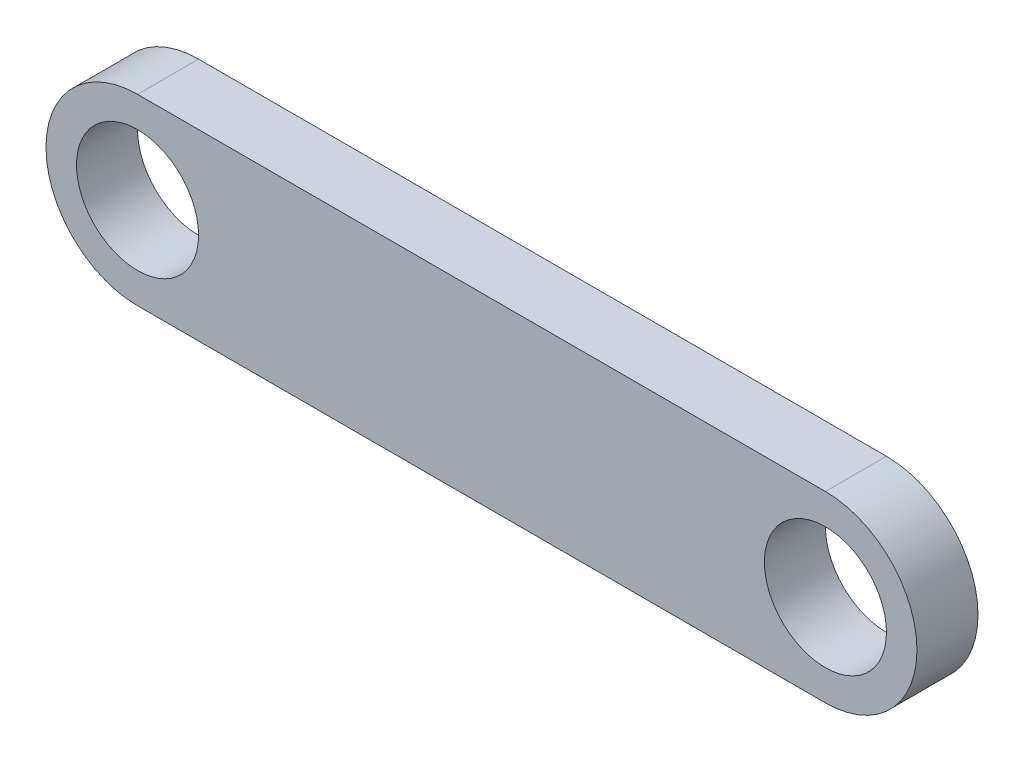
ISO-10303-21;
HEADER;
FILE_DESCRIPTION(('STEP AP214'),'2;1');
FILE_NAME('part.step','',(''),(''),'','','');
FILE_SCHEMA(('AUTOMOTIVE_DESIGN { 1 0 10303 214 1 1 1 1 }'));
ENDSEC;
DATA;
#1=APPLICATION_CONTEXT('core data for automotive mechanical design processes');
#2=APPLICATION_PROTOCOL_DEFINITION('international standard','automotive_design',2000,#1);
#3=PRODUCT_CONTEXT('',#1,'mechanical');
#4=PRODUCT('Part','Part','',(#3));
#5=PRODUCT_RELATED_PRODUCT_CATEGORY('part','',(#4));
#6=PRODUCT_DEFINITION_FORMATION('','',#4);
#7=PRODUCT_DEFINITION_CONTEXT('part definition',#1,'design');
#8=PRODUCT_DEFINITION('design','',#6,#7);
#9=PRODUCT_DEFINITION_SHAPE('','',#8);
#10=(LENGTH_UNIT() NAMED_UNIT(*) SI_UNIT(.MILLI.,.METRE.));
#11=(NAMED_UNIT(*) PLANE_ANGLE_UNIT() SI_UNIT($,.RADIAN.));
#12=(NAMED_UNIT(*) SI_UNIT($,.STERADIAN.) SOLID_ANGLE_UNIT());
#13=UNCERTAINTY_MEASURE_WITH_UNIT(LENGTH_MEASURE(1.E-05),#10,'distance_accuracy_value','');
#14=(GEOMETRIC_REPRESENTATION_CONTEXT(3) GLOBAL_UNCERTAINTY_ASSIGNED_CONTEXT((#13)) GLOBAL_UNIT_ASSIGNED_CONTEXT((#10,
#11,#12)) REPRESENTATION_CONTEXT('',''));
#15=CARTESIAN_POINT('',(0.,0.,0.));
#16=DIRECTION('',(0.,0.,1.));
#17=DIRECTION('',(1.,0.,0.));
#18=AXIS2_PLACEMENT_3D('',#15,#16,#17);
#19=CARTESIAN_POINT('',(0.,0.,0.5));
#20=DIRECTION('',(0.,0.,1.));
#21=DIRECTION('',(1.,0.,0.));
#22=AXIS2_PLACEMENT_3D('',#19,#20,#21);
#23=PLANE('',#22);
#24=CARTESIAN_POINT('',(-11.2709,0.,0.5));
#25=DIRECTION('',(0.,0.,1.));
#26=DIRECTION('',(1.,0.,0.));
#27=AXIS2_PLACEMENT_3D('',#24,#25,#26);
#28=CIRCLE('',#27,1.);
#29=CARTESIAN_POINT('',(-10.2709,0.,0.5));
#30=VERTEX_POINT('',#29);
#31=EDGE_CURVE('E102',#30,#30,#28,.T.);
#32=ORIENTED_EDGE('',*,*,#31,.F.);
#33=EDGE_LOOP('',(#32));
#34=FACE_BOUND('',#33,.T.);
#35=CARTESIAN_POINT('',(0.,0.,0.5));
#36=DIRECTION('',(0.,0.,1.));
#37=DIRECTION('',(1.,0.,0.));
#38=AXIS2_PLACEMENT_3D('',#35,#36,#37);
#39=CIRCLE('',#38,1.5);
#40=CARTESIAN_POINT('',(0.,-1.5,0.5));
#41=VERTEX_POINT('',#40);
#42=CARTESIAN_POINT('',(0.,1.5,0.5));
#43=VERTEX_POINT('',#42);
#44=EDGE_CURVE('E87',#41,#43,#39,.T.);
#45=ORIENTED_EDGE('',*,*,#44,.T.);
#46=DIRECTION('',(-1.,0.,0.));
#47=VECTOR('',#46,1.);
#48=CARTESIAN_POINT('',(0.,1.5,0.5));
#49=LINE('',#48,#47);
#50=CARTESIAN_POINT('',(-11.2709,1.5,0.5));
#51=VERTEX_POINT('',#50);
#52=EDGE_CURVE('E82',#43,#51,#49,.T.);
#53=ORIENTED_EDGE('',*,*,#52,.T.);
#54=CARTESIAN_POINT('',(-11.2709,0.,0.5));
#55=DIRECTION('',(0.,0.,1.));
#56=DIRECTION('',(1.,0.,0.));
#57=AXIS2_PLACEMENT_3D('',#54,#55,#56);
#58=CIRCLE('',#57,1.5);
#59=CARTESIAN_POINT('',(-11.2709,-1.5,0.5));
#60=VERTEX_POINT('',#59);
#61=EDGE_CURVE('E85',#51,#60,#58,.T.);
#62=ORIENTED_EDGE('',*,*,#61,.T.);
#63=DIRECTION('',(1.,0.,0.));
#64=VECTOR('',#63,1.);
#65=CARTESIAN_POINT('',(0.,-1.5,0.5));
#66=LINE('',#65,#64);
#67=EDGE_CURVE('E52',#60,#41,#66,.T.);
#68=ORIENTED_EDGE('',*,*,#67,.T.);
#69=EDGE_LOOP('',(#45,#53,#62,#68));
#70=FACE_BOUND('',#69,.T.);
#71=CARTESIAN_POINT('',(0.,0.,0.5));
#72=DIRECTION('',(0.,0.,1.));
#73=DIRECTION('',(1.,0.,0.));
#74=AXIS2_PLACEMENT_3D('',#71,#72,#73);
#75=CIRCLE('',#74,1.);
#76=CARTESIAN_POINT('',(1.,0.,0.5));
#77=VERTEX_POINT('',#76);
#78=EDGE_CURVE('E117',#77,#77,#75,.T.);
#79=ORIENTED_EDGE('',*,*,#78,.F.);
#80=EDGE_LOOP('',(#79));
#81=FACE_BOUND('',#80,.T.);
#82=ADVANCED_FACE('F35',(#34,#70,#81),#23,.T.);
#83=CARTESIAN_POINT('',(0.,0.,-0.5));
#84=DIRECTION('',(0.,0.,1.));
#85=DIRECTION('',(1.,0.,0.));
#86=AXIS2_PLACEMENT_3D('',#83,#84,#85);
#87=PLANE('',#86);
#88=CARTESIAN_POINT('',(0.,0.,-0.5));
#89=DIRECTION('',(0.,0.,1.));
#90=DIRECTION('',(1.,0.,0.));
#91=AXIS2_PLACEMENT_3D('',#88,#89,#90);
#92=CIRCLE('',#91,1.5);
#93=CARTESIAN_POINT('',(0.,-1.5,-0.5));
#94=VERTEX_POINT('',#93);
#95=CARTESIAN_POINT('',(0.,1.5,-0.5));
#96=VERTEX_POINT('',#95);
#97=EDGE_CURVE('E99',#94,#96,#92,.T.);
#98=ORIENTED_EDGE('',*,*,#97,.F.);
#99=DIRECTION('',(1.,0.,0.));
#100=VECTOR('',#99,1.);
#101=CARTESIAN_POINT('',(0.,-1.5,-0.5));
#102=LINE('',#101,#100);
#103=CARTESIAN_POINT('',(-11.2709,-1.5,-0.5));
#104=VERTEX_POINT('',#103);
#105=EDGE_CURVE('E75',#104,#94,#102,.T.);
#106=ORIENTED_EDGE('',*,*,#105,.F.);
#107=CARTESIAN_POINT('',(-11.2709,0.,-0.5));
#108=DIRECTION('',(0.,0.,1.));
#109=DIRECTION('',(1.,0.,0.));
#110=AXIS2_PLACEMENT_3D('',#107,#108,#109);
#111=CIRCLE('',#110,1.5);
#112=CARTESIAN_POINT('',(-11.2709,1.5,-0.5));
#113=VERTEX_POINT('',#112);
#114=EDGE_CURVE('E69',#113,#104,#111,.T.);
#115=ORIENTED_EDGE('',*,*,#114,.F.);
#116=DIRECTION('',(-1.,0.,0.));
#117=VECTOR('',#116,1.);
#118=CARTESIAN_POINT('',(0.,1.5,-0.5));
#119=LINE('',#118,#117);
#120=EDGE_CURVE('E91',#96,#113,#119,.T.);
#121=ORIENTED_EDGE('',*,*,#120,.F.);
#122=EDGE_LOOP('',(#98,#106,#115,#121));
#123=FACE_BOUND('',#122,.T.);
#124=CARTESIAN_POINT('',(-11.2709,0.,-0.5));
#125=DIRECTION('',(0.,0.,1.));
#126=DIRECTION('',(1.,0.,0.));
#127=AXIS2_PLACEMENT_3D('',#124,#125,#126);
#128=CIRCLE('',#127,1.);
#129=CARTESIAN_POINT('',(-10.2709,0.,-0.5));
#130=VERTEX_POINT('',#129);
#131=EDGE_CURVE('E114',#130,#130,#128,.T.);
#132=ORIENTED_EDGE('',*,*,#131,.T.);
#133=EDGE_LOOP('',(#132));
#134=FACE_BOUND('',#133,.T.);
#135=CARTESIAN_POINT('',(0.,0.,-0.5));
#136=DIRECTION('',(0.,0.,1.));
#137=DIRECTION('',(1.,0.,0.));
#138=AXIS2_PLACEMENT_3D('',#135,#136,#137);
#139=CIRCLE('',#138,1.);
#140=CARTESIAN_POINT('',(1.,0.,-0.5));
#141=VERTEX_POINT('',#140);
#142=EDGE_CURVE('E120',#141,#141,#139,.T.);
#143=ORIENTED_EDGE('',*,*,#142,.T.);
#144=EDGE_LOOP('',(#143));
#145=FACE_BOUND('',#144,.T.);
#146=ADVANCED_FACE('F110',(#123,#134,#145),#87,.F.);
#147=CARTESIAN_POINT('',(0.,0.,0.5));
#148=DIRECTION('',(0.,0.,-1.));
#149=DIRECTION('',(-1.,0.,0.));
#150=AXIS2_PLACEMENT_3D('',#147,#148,#149);
#151=CYLINDRICAL_SURFACE('',#150,1.5);
#152=ORIENTED_EDGE('',*,*,#97,.T.);
#153=DIRECTION('',(0.,0.,-1.));
#154=VECTOR('',#153,1.);
#155=CARTESIAN_POINT('',(0.,1.5,0.5));
#156=LINE('',#155,#154);
#157=EDGE_CURVE('E11',#43,#96,#156,.T.);
#158=ORIENTED_EDGE('',*,*,#157,.F.);
#159=ORIENTED_EDGE('',*,*,#44,.F.);
#160=DIRECTION('',(0.,0.,-1.));
#161=VECTOR('',#160,1.);
#162=CARTESIAN_POINT('',(0.,-1.5,0.5));
#163=LINE('',#162,#161);
#164=EDGE_CURVE('E95',#41,#94,#163,.T.);
#165=ORIENTED_EDGE('',*,*,#164,.T.);
#166=EDGE_LOOP('',(#152,#158,#159,#165));
#167=FACE_BOUND('',#166,.T.);
#168=ADVANCED_FACE('F37',(#167),#151,.T.);
#169=CARTESIAN_POINT('',(0.,1.5,0.5));
#170=DIRECTION('',(0.,-1.,0.));
#171=DIRECTION('',(1.,0.,0.));
#172=AXIS2_PLACEMENT_3D('',#169,#170,#171);
#173=PLANE('',#172);
#174=ORIENTED_EDGE('',*,*,#120,.T.);
#175=DIRECTION('',(0.,0.,-1.));
#176=VECTOR('',#175,1.);
#177=CARTESIAN_POINT('',(-11.2709,1.5,0.5));
#178=LINE('',#177,#176);
#179=EDGE_CURVE('E44',#51,#113,#178,.T.);
#180=ORIENTED_EDGE('',*,*,#179,.F.);
#181=ORIENTED_EDGE('',*,*,#52,.F.);
#182=ORIENTED_EDGE('',*,*,#157,.T.);
#183=EDGE_LOOP('',(#174,#180,#181,#182));
#184=FACE_BOUND('',#183,.T.);
#185=ADVANCED_FACE('F90',(#184),#173,.F.);
#186=CARTESIAN_POINT('',(-11.2709,0.,0.5));
#187=DIRECTION('',(0.,0.,-1.));
#188=DIRECTION('',(-1.,0.,0.));
#189=AXIS2_PLACEMENT_3D('',#186,#187,#188);
#190=CYLINDRICAL_SURFACE('',#189,1.5);
#191=ORIENTED_EDGE('',*,*,#114,.T.);
#192=DIRECTION('',(0.,0.,-1.));
#193=VECTOR('',#192,1.);
#194=CARTESIAN_POINT('',(-11.2709,-1.5,0.5));
#195=LINE('',#194,#193);
#196=EDGE_CURVE('E92',#60,#104,#195,.T.);
#197=ORIENTED_EDGE('',*,*,#196,.F.);
#198=ORIENTED_EDGE('',*,*,#61,.F.);
#199=ORIENTED_EDGE('',*,*,#179,.T.);
#200=EDGE_LOOP('',(#191,#197,#198,#199));
#201=FACE_BOUND('',#200,.T.);
#202=ADVANCED_FACE('F93',(#201),#190,.T.);
#203=CARTESIAN_POINT('',(0.,-1.5,0.5));
#204=DIRECTION('',(0.,1.,0.));
#205=DIRECTION('',(-1.,0.,0.));
#206=AXIS2_PLACEMENT_3D('',#203,#204,#205);
#207=PLANE('',#206);
#208=ORIENTED_EDGE('',*,*,#105,.T.);
#209=ORIENTED_EDGE('',*,*,#164,.F.);
#210=ORIENTED_EDGE('',*,*,#67,.F.);
#211=ORIENTED_EDGE('',*,*,#196,.T.);
#212=EDGE_LOOP('',(#208,#209,#210,#211));
#213=FACE_BOUND('',#212,.T.);
#214=ADVANCED_FACE('F107',(#213),#207,.F.);
#215=CARTESIAN_POINT('',(-11.2709,0.,0.5));
#216=DIRECTION('',(0.,0.,-1.));
#217=DIRECTION('',(-1.,0.,0.));
#218=AXIS2_PLACEMENT_3D('',#215,#216,#217);
#219=CYLINDRICAL_SURFACE('',#218,1.);
#220=ORIENTED_EDGE('',*,*,#31,.T.);
#221=EDGE_LOOP('',(#220));
#222=FACE_BOUND('',#221,.T.);
#223=ORIENTED_EDGE('',*,*,#131,.F.);
#224=EDGE_LOOP('',(#223));
#225=FACE_BOUND('',#224,.T.);
#226=ADVANCED_FACE('F137',(#222,#225),#219,.F.);
#227=CARTESIAN_POINT('',(0.,0.,0.5));
#228=DIRECTION('',(0.,0.,-1.));
#229=DIRECTION('',(-1.,0.,0.));
#230=AXIS2_PLACEMENT_3D('',#227,#228,#229);
#231=CYLINDRICAL_SURFACE('',#230,1.);
#232=ORIENTED_EDGE('',*,*,#78,.T.);
#233=EDGE_LOOP('',(#232));
#234=FACE_BOUND('',#233,.T.);
#235=ORIENTED_EDGE('',*,*,#142,.F.);
#236=EDGE_LOOP('',(#235));
#237=FACE_BOUND('',#236,.T.);
#238=ADVANCED_FACE('F126',(#234,#237),#231,.F.);
#239=CLOSED_SHELL('',(#82,#146,#168,#185,#202,#214,#226,#238));
#240=MANIFOLD_SOLID_BREP('B2',#239);
#241=ADVANCED_BREP_SHAPE_REPRESENTATION('',(#18,#240),#14);
#242=SHAPE_DEFINITION_REPRESENTATION(#9,#241);
ENDSEC;
END-ISO-10303-21;
